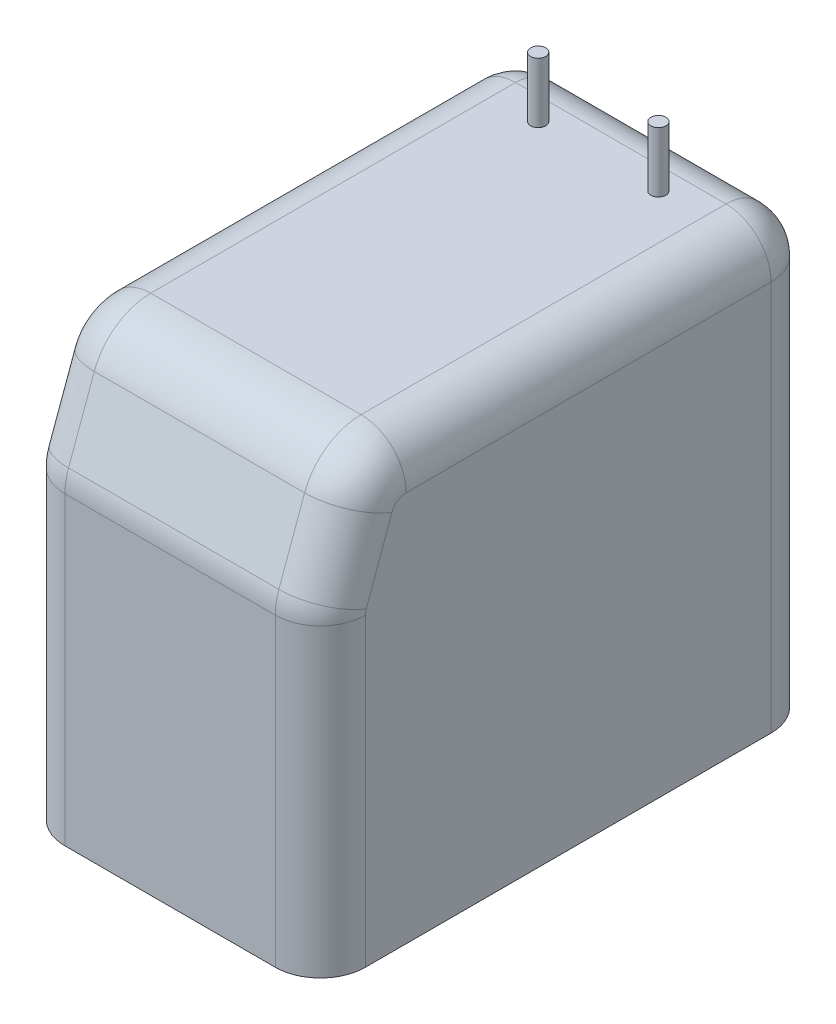
ISO-10303-21;
HEADER;
FILE_DESCRIPTION(('STEP AP214'),'2;1');
FILE_NAME('part.step','',(''),(''),'','','');
FILE_SCHEMA(('AUTOMOTIVE_DESIGN { 1 0 10303 214 1 1 1 1 }'));
ENDSEC;
DATA;
#1=APPLICATION_CONTEXT('core data for automotive mechanical design processes');
#2=APPLICATION_PROTOCOL_DEFINITION('international standard','automotive_design',2000,#1);
#3=PRODUCT_CONTEXT('',#1,'mechanical');
#4=PRODUCT('Part','Part','',(#3));
#5=PRODUCT_RELATED_PRODUCT_CATEGORY('part','',(#4));
#6=PRODUCT_DEFINITION_FORMATION('','',#4);
#7=PRODUCT_DEFINITION_CONTEXT('part definition',#1,'design');
#8=PRODUCT_DEFINITION('design','',#6,#7);
#9=PRODUCT_DEFINITION_SHAPE('','',#8);
#10=(LENGTH_UNIT() NAMED_UNIT(*) SI_UNIT(.MILLI.,.METRE.));
#11=(NAMED_UNIT(*) PLANE_ANGLE_UNIT() SI_UNIT($,.RADIAN.));
#12=(NAMED_UNIT(*) SI_UNIT($,.STERADIAN.) SOLID_ANGLE_UNIT());
#13=UNCERTAINTY_MEASURE_WITH_UNIT(LENGTH_MEASURE(1.E-05),#10,'distance_accuracy_value','');
#14=(GEOMETRIC_REPRESENTATION_CONTEXT(3) GLOBAL_UNCERTAINTY_ASSIGNED_CONTEXT((#13)) GLOBAL_UNIT_ASSIGNED_CONTEXT((#10,
#11,#12)) REPRESENTATION_CONTEXT('',''));
#15=CARTESIAN_POINT('',(0.,0.,0.));
#16=DIRECTION('',(0.,0.,1.));
#17=DIRECTION('',(1.,0.,0.));
#18=AXIS2_PLACEMENT_3D('',#15,#16,#17);
#19=CARTESIAN_POINT('',(127.,368.3,-209.55));
#20=DIRECTION('',(-1.,0.,0.));
#21=DIRECTION('',(0.,0.,1.));
#22=AXIS2_PLACEMENT_3D('',#19,#20,#21);
#23=PLANE('',#22);
#24=DIRECTION('',(0.,0.,-1.));
#25=VECTOR('',#24,1.);
#26=CARTESIAN_POINT('',(127.,0.,-209.55));
#27=LINE('',#26,#25);
#28=CARTESIAN_POINT('',(127.,0.,171.45));
#29=VERTEX_POINT('',#28);
#30=CARTESIAN_POINT('',(127.,0.,-171.45));
#31=VERTEX_POINT('',#30);
#32=EDGE_CURVE('E340',#29,#31,#27,.T.);
#33=ORIENTED_EDGE('',*,*,#32,.T.);
#34=DIRECTION('',(0.,-1.,0.));
#35=VECTOR('',#34,1.);
#36=CARTESIAN_POINT('',(127.,368.3,-171.45));
#37=LINE('',#36,#35);
#38=CARTESIAN_POINT('',(127.,330.2,-171.45));
#39=VERTEX_POINT('',#38);
#40=EDGE_CURVE('E11',#31,#39,#37,.F.);
#41=ORIENTED_EDGE('',*,*,#40,.T.);
#42=DIRECTION('',(0.,0.,-1.));
#43=VECTOR('',#42,1.);
#44=CARTESIAN_POINT('',(127.,330.2,137.0000812575));
#45=LINE('',#44,#43);
#46=CARTESIAN_POINT('',(127.,330.2,137.0000812575));
#47=VERTEX_POINT('',#46);
#48=EDGE_CURVE('E239',#39,#47,#45,.F.);
#49=ORIENTED_EDGE('',*,*,#48,.T.);
#50=CARTESIAN_POINT('',(127.,317.5,137.0000812575));
#51=DIRECTION('',(-1.,0.,0.));
#52=DIRECTION('',(0.,0.,1.));
#53=AXIS2_PLACEMENT_3D('',#50,#51,#52);
#54=CIRCLE('',#53,12.7);
#55=CARTESIAN_POINT('',(127.,321.843655820236,148.934177541481));
#56=VERTEX_POINT('',#55);
#57=EDGE_CURVE('E236',#47,#56,#54,.F.);
#58=ORIENTED_EDGE('',*,*,#57,.T.);
#59=DIRECTION('',(0.,-0.93969262078591,0.342020143325666));
#60=VECTOR('',#59,1.);
#61=CARTESIAN_POINT('',(127.,262.086245200245,170.684096283981));
#62=LINE('',#61,#60);
#63=CARTESIAN_POINT('',(127.,262.086245200245,170.684096283981));
#64=VERTEX_POINT('',#63);
#65=EDGE_CURVE('E233',#56,#64,#62,.T.);
#66=ORIENTED_EDGE('',*,*,#65,.T.);
#67=CARTESIAN_POINT('',(127.,257.742589380009,158.75));
#68=DIRECTION('',(-1.,0.,0.));
#69=DIRECTION('',(0.,0.,1.));
#70=AXIS2_PLACEMENT_3D('',#67,#68,#69);
#71=CIRCLE('',#70,12.7);
#72=CARTESIAN_POINT('',(127.,257.742589380009,171.45));
#73=VERTEX_POINT('',#72);
#74=EDGE_CURVE('E230',#64,#73,#71,.F.);
#75=ORIENTED_EDGE('',*,*,#74,.T.);
#76=DIRECTION('',(0.,-1.,0.));
#77=VECTOR('',#76,1.);
#78=CARTESIAN_POINT('',(127.,368.3,171.45));
#79=LINE('',#78,#77);
#80=EDGE_CURVE('E227',#73,#29,#79,.T.);
#81=ORIENTED_EDGE('',*,*,#80,.T.);
#82=EDGE_LOOP('',(#33,#41,#49,#58,#66,#75,#81));
#83=FACE_BOUND('',#82,.T.);
#84=ADVANCED_FACE('F41',(#83),#23,.F.);
#85=CARTESIAN_POINT('',(-127.,368.3,-209.55));
#86=DIRECTION('',(0.,0.,1.));
#87=DIRECTION('',(1.,0.,0.));
#88=AXIS2_PLACEMENT_3D('',#85,#86,#87);
#89=PLANE('',#88);
#90=DIRECTION('',(-1.,0.,0.));
#91=VECTOR('',#90,1.);
#92=CARTESIAN_POINT('',(-127.,0.,-209.55));
#93=LINE('',#92,#91);
#94=CARTESIAN_POINT('',(88.9,0.,-209.55));
#95=VERTEX_POINT('',#94);
#96=CARTESIAN_POINT('',(-88.9,0.,-209.55));
#97=VERTEX_POINT('',#96);
#98=EDGE_CURVE('E332',#95,#97,#93,.T.);
#99=ORIENTED_EDGE('',*,*,#98,.T.);
#100=DIRECTION('',(0.,-1.,0.));
#101=VECTOR('',#100,1.);
#102=CARTESIAN_POINT('',(-88.9,368.3,-209.55));
#103=LINE('',#102,#101);
#104=CARTESIAN_POINT('',(-88.9,330.2,-209.55));
#105=VERTEX_POINT('',#104);
#106=EDGE_CURVE('E297',#97,#105,#103,.F.);
#107=ORIENTED_EDGE('',*,*,#106,.T.);
#108=DIRECTION('',(-1.,0.,0.));
#109=VECTOR('',#108,1.);
#110=CARTESIAN_POINT('',(88.9,330.2,-209.55));
#111=LINE('',#110,#109);
#112=CARTESIAN_POINT('',(88.9,330.2,-209.55));
#113=VERTEX_POINT('',#112);
#114=EDGE_CURVE('E294',#105,#113,#111,.F.);
#115=ORIENTED_EDGE('',*,*,#114,.T.);
#116=DIRECTION('',(0.,-1.,0.));
#117=VECTOR('',#116,1.);
#118=CARTESIAN_POINT('',(88.9,368.3,-209.55));
#119=LINE('',#118,#117);
#120=EDGE_CURVE('E291',#113,#95,#119,.T.);
#121=ORIENTED_EDGE('',*,*,#120,.T.);
#122=EDGE_LOOP('',(#99,#107,#115,#121));
#123=FACE_BOUND('',#122,.T.);
#124=ADVANCED_FACE('F331',(#123),#89,.F.);
#125=CARTESIAN_POINT('',(-127.,368.3,-209.55));
#126=DIRECTION('',(1.,0.,0.));
#127=DIRECTION('',(0.,0.,-1.));
#128=AXIS2_PLACEMENT_3D('',#125,#126,#127);
#129=PLANE('',#128);
#130=DIRECTION('',(0.,0.,1.));
#131=VECTOR('',#130,1.);
#132=CARTESIAN_POINT('',(-127.,330.2,-209.55));
#133=LINE('',#132,#131);
#134=CARTESIAN_POINT('',(-127.,330.2,137.0000812575));
#135=VERTEX_POINT('',#134);
#136=CARTESIAN_POINT('',(-127.,330.2,-171.45));
#137=VERTEX_POINT('',#136);
#138=EDGE_CURVE('E170',#135,#137,#133,.F.);
#139=ORIENTED_EDGE('',*,*,#138,.T.);
#140=DIRECTION('',(0.,-1.,0.));
#141=VECTOR('',#140,1.);
#142=CARTESIAN_POINT('',(-127.,368.3,-171.45));
#143=LINE('',#142,#141);
#144=CARTESIAN_POINT('',(-127.,0.,-171.45));
#145=VERTEX_POINT('',#144);
#146=EDGE_CURVE('E254',#137,#145,#143,.T.);
#147=ORIENTED_EDGE('',*,*,#146,.T.);
#148=DIRECTION('',(0.,0.,1.));
#149=VECTOR('',#148,1.);
#150=CARTESIAN_POINT('',(-127.,0.,-209.55));
#151=LINE('',#150,#149);
#152=CARTESIAN_POINT('',(-127.,0.,171.45));
#153=VERTEX_POINT('',#152);
#154=EDGE_CURVE('E339',#145,#153,#151,.T.);
#155=ORIENTED_EDGE('',*,*,#154,.T.);
#156=DIRECTION('',(0.,-1.,0.));
#157=VECTOR('',#156,1.);
#158=CARTESIAN_POINT('',(-127.,368.3,171.45));
#159=LINE('',#158,#157);
#160=CARTESIAN_POINT('',(-127.,257.742589380009,171.45));
#161=VERTEX_POINT('',#160);
#162=EDGE_CURVE('E161',#153,#161,#159,.F.);
#163=ORIENTED_EDGE('',*,*,#162,.T.);
#164=CARTESIAN_POINT('',(-127.,257.742589380009,158.75));
#165=DIRECTION('',(1.,0.,0.));
#166=DIRECTION('',(0.,0.,-1.));
#167=AXIS2_PLACEMENT_3D('',#164,#165,#166);
#168=CIRCLE('',#167,12.7);
#169=CARTESIAN_POINT('',(-127.,262.086245200245,170.684096283981));
#170=VERTEX_POINT('',#169);
#171=EDGE_CURVE('E203',#161,#170,#168,.F.);
#172=ORIENTED_EDGE('',*,*,#171,.T.);
#173=DIRECTION('',(0.,0.93969262078591,-0.342020143325666));
#174=VECTOR('',#173,1.);
#175=CARTESIAN_POINT('',(-127.,321.843655820236,148.934177541481));
#176=LINE('',#175,#174);
#177=CARTESIAN_POINT('',(-127.,321.843655820236,148.934177541481));
#178=VERTEX_POINT('',#177);
#179=EDGE_CURVE('E206',#170,#178,#176,.T.);
#180=ORIENTED_EDGE('',*,*,#179,.T.);
#181=CARTESIAN_POINT('',(-127.,317.5,137.0000812575));
#182=DIRECTION('',(1.,0.,0.));
#183=DIRECTION('',(0.,0.,-1.));
#184=AXIS2_PLACEMENT_3D('',#181,#182,#183);
#185=CIRCLE('',#184,12.7);
#186=EDGE_CURVE('E209',#178,#135,#185,.F.);
#187=ORIENTED_EDGE('',*,*,#186,.T.);
#188=EDGE_LOOP('',(#139,#147,#155,#163,#172,#180,#187));
#189=FACE_BOUND('',#188,.T.);
#190=ADVANCED_FACE('F414',(#189),#129,.F.);
#191=CARTESIAN_POINT('',(-127.,368.3,209.55));
#192=DIRECTION('',(0.,0.,-1.));
#193=DIRECTION('',(-1.,0.,0.));
#194=AXIS2_PLACEMENT_3D('',#191,#192,#193);
#195=PLANE('',#194);
#196=DIRECTION('',(-1.,0.,0.));
#197=VECTOR('',#196,1.);
#198=CARTESIAN_POINT('',(-127.,257.742589380009,209.55));
#199=LINE('',#198,#197);
#200=CARTESIAN_POINT('',(88.9,257.742589380009,209.55));
#201=VERTEX_POINT('',#200);
#202=CARTESIAN_POINT('',(-88.9,257.742589380009,209.55));
#203=VERTEX_POINT('',#202);
#204=EDGE_CURVE('E353',#201,#203,#199,.T.);
#205=ORIENTED_EDGE('',*,*,#204,.T.);
#206=DIRECTION('',(0.,-1.,0.));
#207=VECTOR('',#206,1.);
#208=CARTESIAN_POINT('',(-88.9,368.3,209.55));
#209=LINE('',#208,#207);
#210=CARTESIAN_POINT('',(-88.9,0.,209.55));
#211=VERTEX_POINT('',#210);
#212=EDGE_CURVE('E245',#203,#211,#209,.T.);
#213=ORIENTED_EDGE('',*,*,#212,.T.);
#214=DIRECTION('',(1.,0.,0.));
#215=VECTOR('',#214,1.);
#216=CARTESIAN_POINT('',(-127.,0.,209.55));
#217=LINE('',#216,#215);
#218=CARTESIAN_POINT('',(88.9,0.,209.55));
#219=VERTEX_POINT('',#218);
#220=EDGE_CURVE('E344',#211,#219,#217,.T.);
#221=ORIENTED_EDGE('',*,*,#220,.T.);
#222=DIRECTION('',(0.,-1.,0.));
#223=VECTOR('',#222,1.);
#224=CARTESIAN_POINT('',(88.9,368.3,209.55));
#225=LINE('',#224,#223);
#226=EDGE_CURVE('E242',#219,#201,#225,.F.);
#227=ORIENTED_EDGE('',*,*,#226,.T.);
#228=EDGE_LOOP('',(#205,#213,#221,#227));
#229=FACE_BOUND('',#228,.T.);
#230=ADVANCED_FACE('F378',(#229),#195,.F.);
#231=CARTESIAN_POINT('',(0.,368.3,0.));
#232=DIRECTION('',(0.,1.,0.));
#233=DIRECTION('',(0.,0.,1.));
#234=AXIS2_PLACEMENT_3D('',#231,#232,#233);
#235=PLANE('',#234);
#236=CARTESIAN_POINT('',(50.8,368.3,-152.4));
#237=DIRECTION('',(0.,1.,0.));
#238=DIRECTION('',(0.,0.,1.));
#239=AXIS2_PLACEMENT_3D('',#236,#237,#238);
#240=CIRCLE('',#239,6.34999999999999);
#241=CARTESIAN_POINT('',(50.8,368.3,-146.05));
#242=VERTEX_POINT('',#241);
#243=EDGE_CURVE('E266',#242,#242,#240,.T.);
#244=ORIENTED_EDGE('',*,*,#243,.F.);
#245=EDGE_LOOP('',(#244));
#246=FACE_BOUND('',#245,.T.);
#247=CARTESIAN_POINT('',(-50.8,368.3,-152.4));
#248=DIRECTION('',(0.,1.,0.));
#249=DIRECTION('',(0.,0.,1.));
#250=AXIS2_PLACEMENT_3D('',#247,#248,#249);
#251=CIRCLE('',#250,6.34999999999999);
#252=CARTESIAN_POINT('',(-50.8,368.3,-146.05));
#253=VERTEX_POINT('',#252);
#254=EDGE_CURVE('E660',#253,#253,#251,.T.);
#255=ORIENTED_EDGE('',*,*,#254,.F.);
#256=EDGE_LOOP('',(#255));
#257=FACE_BOUND('',#256,.T.);
#258=DIRECTION('',(0.,0.,-1.));
#259=VECTOR('',#258,1.);
#260=CARTESIAN_POINT('',(88.9,368.3,-209.55));
#261=LINE('',#260,#259);
#262=CARTESIAN_POINT('',(88.9,368.3,137.0000812575));
#263=VERTEX_POINT('',#262);
#264=CARTESIAN_POINT('',(88.9,368.3,-171.45));
#265=VERTEX_POINT('',#264);
#266=EDGE_CURVE('E162',#263,#265,#261,.T.);
#267=ORIENTED_EDGE('',*,*,#266,.T.);
#268=DIRECTION('',(-1.,0.,0.));
#269=VECTOR('',#268,1.);
#270=CARTESIAN_POINT('',(-88.9,368.3,-171.45));
#271=LINE('',#270,#269);
#272=CARTESIAN_POINT('',(-88.9,368.3,-171.45));
#273=VERTEX_POINT('',#272);
#274=EDGE_CURVE('E157',#265,#273,#271,.T.);
#275=ORIENTED_EDGE('',*,*,#274,.T.);
#276=DIRECTION('',(0.,0.,1.));
#277=VECTOR('',#276,1.);
#278=CARTESIAN_POINT('',(-88.9,368.3,137.0000812575));
#279=LINE('',#278,#277);
#280=CARTESIAN_POINT('',(-88.9,368.3,137.0000812575));
#281=VERTEX_POINT('',#280);
#282=EDGE_CURVE('E150',#273,#281,#279,.T.);
#283=ORIENTED_EDGE('',*,*,#282,.T.);
#284=DIRECTION('',(1.,0.,0.));
#285=VECTOR('',#284,1.);
#286=CARTESIAN_POINT('',(0.,368.3,137.0000812575));
#287=LINE('',#286,#285);
#288=EDGE_CURVE('E154',#281,#263,#287,.T.);
#289=ORIENTED_EDGE('',*,*,#288,.T.);
#290=EDGE_LOOP('',(#267,#275,#283,#289));
#291=FACE_BOUND('',#290,.T.);
#292=ADVANCED_FACE('F152',(#246,#257,#291),#235,.T.);
#293=CARTESIAN_POINT('',(0.,0.,0.));
#294=DIRECTION('',(0.,1.,0.));
#295=DIRECTION('',(0.,0.,1.));
#296=AXIS2_PLACEMENT_3D('',#293,#294,#295);
#297=PLANE('',#296);
#298=ORIENTED_EDGE('',*,*,#154,.F.);
#299=CARTESIAN_POINT('',(-88.9,0.,-171.45));
#300=DIRECTION('',(0.,1.,0.));
#301=DIRECTION('',(0.,0.,1.));
#302=AXIS2_PLACEMENT_3D('',#299,#300,#301);
#303=CIRCLE('',#302,38.1);
#304=EDGE_CURVE('E288',#145,#97,#303,.F.);
#305=ORIENTED_EDGE('',*,*,#304,.T.);
#306=ORIENTED_EDGE('',*,*,#98,.F.);
#307=CARTESIAN_POINT('',(88.9,0.,-171.45));
#308=DIRECTION('',(0.,1.,0.));
#309=DIRECTION('',(0.,0.,1.));
#310=AXIS2_PLACEMENT_3D('',#307,#308,#309);
#311=CIRCLE('',#310,38.1);
#312=EDGE_CURVE('E285',#95,#31,#311,.F.);
#313=ORIENTED_EDGE('',*,*,#312,.T.);
#314=ORIENTED_EDGE('',*,*,#32,.F.);
#315=CARTESIAN_POINT('',(88.9,0.,171.45));
#316=DIRECTION('',(0.,1.,0.));
#317=DIRECTION('',(0.,0.,1.));
#318=AXIS2_PLACEMENT_3D('',#315,#316,#317);
#319=CIRCLE('',#318,38.1);
#320=EDGE_CURVE('E248',#29,#219,#319,.F.);
#321=ORIENTED_EDGE('',*,*,#320,.T.);
#322=ORIENTED_EDGE('',*,*,#220,.F.);
#323=CARTESIAN_POINT('',(-88.9,0.,171.45));
#324=DIRECTION('',(0.,1.,0.));
#325=DIRECTION('',(0.,0.,1.));
#326=AXIS2_PLACEMENT_3D('',#323,#324,#325);
#327=CIRCLE('',#326,38.1);
#328=EDGE_CURVE('E251',#211,#153,#327,.F.);
#329=ORIENTED_EDGE('',*,*,#328,.T.);
#330=EDGE_LOOP('',(#298,#305,#306,#313,#314,#321,#322,#329));
#331=FACE_BOUND('',#330,.T.);
#332=ADVANCED_FACE('F336',(#331),#297,.F.);
#333=CARTESIAN_POINT('',(0.,368.3,172.570624198554));
#334=DIRECTION('',(0.,0.342020143325666,0.939692620785909));
#335=DIRECTION('',(-1.,0.,0.));
#336=AXIS2_PLACEMENT_3D('',#333,#334,#335);
#337=PLANE('',#336);
#338=DIRECTION('',(1.,0.,0.));
#339=VECTOR('',#338,1.);
#340=CARTESIAN_POINT('',(0.,334.874623280944,184.736466393425));
#341=LINE('',#340,#339);
#342=CARTESIAN_POINT('',(88.9,334.874623280944,184.736466393425));
#343=VERTEX_POINT('',#342);
#344=CARTESIAN_POINT('',(-88.9,334.874623280944,184.736466393425));
#345=VERTEX_POINT('',#344);
#346=EDGE_CURVE('E197',#343,#345,#341,.F.);
#347=ORIENTED_EDGE('',*,*,#346,.T.);
#348=DIRECTION('',(0.,0.93969262078591,-0.342020143325666));
#349=VECTOR('',#348,1.);
#350=CARTESIAN_POINT('',(-88.9,275.117212660953,206.486385135924));
#351=LINE('',#350,#349);
#352=CARTESIAN_POINT('',(-88.9,275.117212660953,206.486385135924));
#353=VERTEX_POINT('',#352);
#354=EDGE_CURVE('E218',#345,#353,#351,.F.);
#355=ORIENTED_EDGE('',*,*,#354,.T.);
#356=DIRECTION('',(-1.,0.,0.));
#357=VECTOR('',#356,1.);
#358=CARTESIAN_POINT('',(127.,275.117212660953,206.486385135924));
#359=LINE('',#358,#357);
#360=CARTESIAN_POINT('',(88.9,275.117212660953,206.486385135924));
#361=VERTEX_POINT('',#360);
#362=EDGE_CURVE('E191',#353,#361,#359,.F.);
#363=ORIENTED_EDGE('',*,*,#362,.T.);
#364=DIRECTION('',(0.,-0.93969262078591,0.342020143325666));
#365=VECTOR('',#364,1.);
#366=CARTESIAN_POINT('',(88.9,334.874623280944,184.736466393425));
#367=LINE('',#366,#365);
#368=EDGE_CURVE('E185',#361,#343,#367,.F.);
#369=ORIENTED_EDGE('',*,*,#368,.T.);
#370=EDGE_LOOP('',(#347,#355,#363,#369));
#371=FACE_BOUND('',#370,.T.);
#372=ADVANCED_FACE('F359',(#371),#337,.T.);
#373=CARTESIAN_POINT('',(-127.,257.742589380009,158.75));
#374=DIRECTION('',(1.,0.,0.));
#375=DIRECTION('',(0.,0.,-1.));
#376=AXIS2_PLACEMENT_3D('',#373,#374,#375);
#377=CYLINDRICAL_SURFACE('',#376,50.8);
#378=ORIENTED_EDGE('',*,*,#362,.F.);
#379=CARTESIAN_POINT('',(-88.9,257.742589380009,158.75));
#380=DIRECTION('',(1.,0.,0.));
#381=DIRECTION('',(0.,0.,-1.));
#382=AXIS2_PLACEMENT_3D('',#379,#380,#381);
#383=CIRCLE('',#382,50.8);
#384=EDGE_CURVE('E224',#353,#203,#383,.T.);
#385=ORIENTED_EDGE('',*,*,#384,.T.);
#386=ORIENTED_EDGE('',*,*,#204,.F.);
#387=CARTESIAN_POINT('',(88.9,257.742589380009,158.75));
#388=DIRECTION('',(-1.,0.,0.));
#389=DIRECTION('',(0.,0.,1.));
#390=AXIS2_PLACEMENT_3D('',#387,#388,#389);
#391=CIRCLE('',#390,50.8);
#392=EDGE_CURVE('E221',#201,#361,#391,.T.);
#393=ORIENTED_EDGE('',*,*,#392,.T.);
#394=EDGE_LOOP('',(#378,#385,#386,#393));
#395=FACE_BOUND('',#394,.T.);
#396=ADVANCED_FACE('F374',(#395),#377,.T.);
#397=CARTESIAN_POINT('',(0.,317.5,137.0000812575));
#398=DIRECTION('',(1.,0.,0.));
#399=DIRECTION('',(0.,0.,-1.));
#400=AXIS2_PLACEMENT_3D('',#397,#398,#399);
#401=CYLINDRICAL_SURFACE('',#400,50.8);
#402=ORIENTED_EDGE('',*,*,#288,.F.);
#403=CARTESIAN_POINT('',(-88.9,317.5,137.0000812575));
#404=DIRECTION('',(1.,0.,0.));
#405=DIRECTION('',(0.,0.,-1.));
#406=AXIS2_PLACEMENT_3D('',#403,#404,#405);
#407=CIRCLE('',#406,50.8);
#408=EDGE_CURVE('E178',#281,#345,#407,.T.);
#409=ORIENTED_EDGE('',*,*,#408,.T.);
#410=ORIENTED_EDGE('',*,*,#346,.F.);
#411=CARTESIAN_POINT('',(88.9,317.5,137.0000812575));
#412=DIRECTION('',(-1.,0.,0.));
#413=DIRECTION('',(0.,0.,1.));
#414=AXIS2_PLACEMENT_3D('',#411,#412,#413);
#415=CIRCLE('',#414,50.8);
#416=EDGE_CURVE('E186',#343,#263,#415,.T.);
#417=ORIENTED_EDGE('',*,*,#416,.T.);
#418=EDGE_LOOP('',(#402,#409,#410,#417));
#419=FACE_BOUND('',#418,.T.);
#420=ADVANCED_FACE('F188',(#419),#401,.T.);
#421=CARTESIAN_POINT('',(-50.8,419.1,-152.4));
#422=DIRECTION('',(0.,-1.,0.));
#423=DIRECTION('',(0.,0.,-1.));
#424=AXIS2_PLACEMENT_3D('',#421,#422,#423);
#425=CYLINDRICAL_SURFACE('',#424,6.34999999999999);
#426=CARTESIAN_POINT('',(-50.8,419.1,-152.4));
#427=DIRECTION('',(0.,1.,0.));
#428=DIRECTION('',(0.,0.,1.));
#429=AXIS2_PLACEMENT_3D('',#426,#427,#428);
#430=CIRCLE('',#429,6.34999999999999);
#431=CARTESIAN_POINT('',(-50.8,419.1,-146.05));
#432=VERTEX_POINT('',#431);
#433=EDGE_CURVE('E346',#432,#432,#430,.T.);
#434=ORIENTED_EDGE('',*,*,#433,.F.);
#435=EDGE_LOOP('',(#434));
#436=FACE_BOUND('',#435,.T.);
#437=ORIENTED_EDGE('',*,*,#254,.T.);
#438=EDGE_LOOP('',(#437));
#439=FACE_BOUND('',#438,.T.);
#440=ADVANCED_FACE('F424',(#436,#439),#425,.T.);
#441=CARTESIAN_POINT('',(-50.8,419.1,-152.4));
#442=DIRECTION('',(0.,1.,0.));
#443=DIRECTION('',(0.,0.,1.));
#444=AXIS2_PLACEMENT_3D('',#441,#442,#443);
#445=PLANE('',#444);
#446=ORIENTED_EDGE('',*,*,#433,.T.);
#447=EDGE_LOOP('',(#446));
#448=FACE_BOUND('',#447,.T.);
#449=ADVANCED_FACE('F443',(#448),#445,.T.);
#450=CARTESIAN_POINT('',(50.8,419.1,-152.4));
#451=DIRECTION('',(0.,-1.,0.));
#452=DIRECTION('',(0.,0.,-1.));
#453=AXIS2_PLACEMENT_3D('',#450,#451,#452);
#454=CYLINDRICAL_SURFACE('',#453,6.34999999999999);
#455=CARTESIAN_POINT('',(50.8,419.1,-152.4));
#456=DIRECTION('',(0.,1.,0.));
#457=DIRECTION('',(0.,0.,1.));
#458=AXIS2_PLACEMENT_3D('',#455,#456,#457);
#459=CIRCLE('',#458,6.34999999999999);
#460=CARTESIAN_POINT('',(50.8,419.1,-146.05));
#461=VERTEX_POINT('',#460);
#462=EDGE_CURVE('E663',#461,#461,#459,.T.);
#463=ORIENTED_EDGE('',*,*,#462,.F.);
#464=EDGE_LOOP('',(#463));
#465=FACE_BOUND('',#464,.T.);
#466=ORIENTED_EDGE('',*,*,#243,.T.);
#467=EDGE_LOOP('',(#466));
#468=FACE_BOUND('',#467,.T.);
#469=ADVANCED_FACE('F437',(#465,#468),#454,.T.);
#470=CARTESIAN_POINT('',(50.8,419.1,-152.4));
#471=DIRECTION('',(0.,1.,0.));
#472=DIRECTION('',(0.,0.,1.));
#473=AXIS2_PLACEMENT_3D('',#470,#471,#472);
#474=PLANE('',#473);
#475=ORIENTED_EDGE('',*,*,#462,.T.);
#476=EDGE_LOOP('',(#475));
#477=FACE_BOUND('',#476,.T.);
#478=ADVANCED_FACE('F433',(#477),#474,.T.);
#479=CARTESIAN_POINT('',(-88.9,368.3,171.45));
#480=DIRECTION('',(0.,-1.,0.));
#481=DIRECTION('',(0.,0.,-1.));
#482=AXIS2_PLACEMENT_3D('',#479,#480,#481);
#483=CYLINDRICAL_SURFACE('',#482,38.1);
#484=ORIENTED_EDGE('',*,*,#328,.F.);
#485=ORIENTED_EDGE('',*,*,#212,.F.);
#486=CARTESIAN_POINT('',(-88.9,257.742589380009,171.45));
#487=DIRECTION('',(0.,1.,0.));
#488=DIRECTION('',(0.,0.,1.));
#489=AXIS2_PLACEMENT_3D('',#486,#487,#488);
#490=CIRCLE('',#489,38.1);
#491=EDGE_CURVE('E262',#161,#203,#490,.T.);
#492=ORIENTED_EDGE('',*,*,#491,.F.);
#493=ORIENTED_EDGE('',*,*,#162,.F.);
#494=EDGE_LOOP('',(#484,#485,#492,#493));
#495=FACE_BOUND('',#494,.T.);
#496=ADVANCED_FACE('F383',(#495),#483,.T.);
#497=CARTESIAN_POINT('',(-88.9,257.742589380009,158.75));
#498=DIRECTION('',(1.,0.,0.));
#499=DIRECTION('',(0.,0.,-1.));
#500=AXIS2_PLACEMENT_3D('',#497,#498,#499);
#501=DEGENERATE_TOROIDAL_SURFACE('',#500,12.7,38.1,.T.);
#502=ORIENTED_EDGE('',*,*,#491,.T.);
#503=ORIENTED_EDGE('',*,*,#384,.F.);
#504=CARTESIAN_POINT('',(-88.9,262.086245200245,170.684096283981));
#505=DIRECTION('',(0.,0.939692620785909,-0.342020143325666));
#506=DIRECTION('',(0.,0.342020143325666,0.939692620785909));
#507=AXIS2_PLACEMENT_3D('',#504,#505,#506);
#508=CIRCLE('',#507,38.1);
#509=EDGE_CURVE('E258',#170,#353,#508,.T.);
#510=ORIENTED_EDGE('',*,*,#509,.F.);
#511=ORIENTED_EDGE('',*,*,#171,.F.);
#512=EDGE_LOOP('',(#502,#503,#510,#511));
#513=FACE_BOUND('',#512,.T.);
#514=ADVANCED_FACE('F370',(#513),#501,.T.);
#515=CARTESIAN_POINT('',(-88.9,478.08023385955,92.0687136315632));
#516=DIRECTION('',(0.,-0.93969262078591,0.342020143325666));
#517=DIRECTION('',(0.,-0.342020143325666,-0.93969262078591));
#518=AXIS2_PLACEMENT_3D('',#515,#516,#517);
#519=CYLINDRICAL_SURFACE('',#518,38.1);
#520=ORIENTED_EDGE('',*,*,#509,.T.);
#521=ORIENTED_EDGE('',*,*,#354,.F.);
#522=CARTESIAN_POINT('',(-88.9,321.843655820236,148.934177541481));
#523=DIRECTION('',(0.,0.939692620785909,-0.342020143325668));
#524=DIRECTION('',(0.,0.342020143325668,0.939692620785909));
#525=AXIS2_PLACEMENT_3D('',#522,#523,#524);
#526=CIRCLE('',#525,38.1);
#527=EDGE_CURVE('E174',#178,#345,#526,.T.);
#528=ORIENTED_EDGE('',*,*,#527,.F.);
#529=ORIENTED_EDGE('',*,*,#179,.F.);
#530=EDGE_LOOP('',(#520,#521,#528,#529));
#531=FACE_BOUND('',#530,.T.);
#532=ADVANCED_FACE('F364',(#531),#519,.T.);
#533=CARTESIAN_POINT('',(-88.9,317.5,137.0000812575));
#534=DIRECTION('',(1.,0.,0.));
#535=DIRECTION('',(0.,0.,-1.));
#536=AXIS2_PLACEMENT_3D('',#533,#534,#535);
#537=DEGENERATE_TOROIDAL_SURFACE('',#536,12.7,38.1,.T.);
#538=ORIENTED_EDGE('',*,*,#527,.T.);
#539=ORIENTED_EDGE('',*,*,#408,.F.);
#540=CARTESIAN_POINT('',(-88.9,330.2,137.0000812575));
#541=DIRECTION('',(0.,0.,-1.));
#542=DIRECTION('',(-1.,0.,0.));
#543=AXIS2_PLACEMENT_3D('',#540,#541,#542);
#544=CIRCLE('',#543,38.1);
#545=EDGE_CURVE('E166',#135,#281,#544,.T.);
#546=ORIENTED_EDGE('',*,*,#545,.F.);
#547=ORIENTED_EDGE('',*,*,#186,.F.);
#548=EDGE_LOOP('',(#538,#539,#546,#547));
#549=FACE_BOUND('',#548,.T.);
#550=ADVANCED_FACE('F179',(#549),#537,.T.);
#551=CARTESIAN_POINT('',(-88.9,330.2,0.));
#552=DIRECTION('',(0.,0.,-1.));
#553=DIRECTION('',(-1.,0.,0.));
#554=AXIS2_PLACEMENT_3D('',#551,#552,#553);
#555=CYLINDRICAL_SURFACE('',#554,38.1);
#556=ORIENTED_EDGE('',*,*,#282,.F.);
#557=CARTESIAN_POINT('',(-88.9,330.2,-171.45));
#558=DIRECTION('',(0.,0.,-1.));
#559=DIRECTION('',(-1.,0.,0.));
#560=AXIS2_PLACEMENT_3D('',#557,#558,#559);
#561=CIRCLE('',#560,38.1);
#562=EDGE_CURVE('E300',#273,#137,#561,.F.);
#563=ORIENTED_EDGE('',*,*,#562,.T.);
#564=ORIENTED_EDGE('',*,*,#138,.F.);
#565=ORIENTED_EDGE('',*,*,#545,.T.);
#566=EDGE_LOOP('',(#556,#563,#564,#565));
#567=FACE_BOUND('',#566,.T.);
#568=ADVANCED_FACE('F168',(#567),#555,.T.);
#569=CARTESIAN_POINT('',(88.9,368.3,171.45));
#570=DIRECTION('',(0.,-1.,0.));
#571=DIRECTION('',(0.,0.,-1.));
#572=AXIS2_PLACEMENT_3D('',#569,#570,#571);
#573=CYLINDRICAL_SURFACE('',#572,38.1);
#574=ORIENTED_EDGE('',*,*,#320,.F.);
#575=ORIENTED_EDGE('',*,*,#80,.F.);
#576=CARTESIAN_POINT('',(88.9,257.742589380009,171.45));
#577=DIRECTION('',(0.,1.,0.));
#578=DIRECTION('',(0.,0.,1.));
#579=AXIS2_PLACEMENT_3D('',#576,#577,#578);
#580=CIRCLE('',#579,38.1);
#581=EDGE_CURVE('E175',#201,#73,#580,.T.);
#582=ORIENTED_EDGE('',*,*,#581,.F.);
#583=ORIENTED_EDGE('',*,*,#226,.F.);
#584=EDGE_LOOP('',(#574,#575,#582,#583));
#585=FACE_BOUND('',#584,.T.);
#586=ADVANCED_FACE('F387',(#585),#573,.T.);
#587=CARTESIAN_POINT('',(88.9,257.742589380009,158.75));
#588=DIRECTION('',(-1.,0.,0.));
#589=DIRECTION('',(0.,0.,1.));
#590=AXIS2_PLACEMENT_3D('',#587,#588,#589);
#591=DEGENERATE_TOROIDAL_SURFACE('',#590,12.7,38.1,.T.);
#592=ORIENTED_EDGE('',*,*,#581,.T.);
#593=ORIENTED_EDGE('',*,*,#74,.F.);
#594=CARTESIAN_POINT('',(88.9,262.086245200245,170.684096283981));
#595=DIRECTION('',(0.,0.939692620785909,-0.342020143325667));
#596=DIRECTION('',(0.,0.342020143325667,0.939692620785909));
#597=AXIS2_PLACEMENT_3D('',#594,#595,#596);
#598=CIRCLE('',#597,38.1);
#599=EDGE_CURVE('E275',#361,#64,#598,.T.);
#600=ORIENTED_EDGE('',*,*,#599,.F.);
#601=ORIENTED_EDGE('',*,*,#392,.F.);
#602=EDGE_LOOP('',(#592,#593,#600,#601));
#603=FACE_BOUND('',#602,.T.);
#604=ADVANCED_FACE('F393',(#603),#591,.T.);
#605=CARTESIAN_POINT('',(88.9,478.08023385955,92.0687136315632));
#606=DIRECTION('',(0.,0.93969262078591,-0.342020143325666));
#607=DIRECTION('',(0.,0.342020143325666,0.93969262078591));
#608=AXIS2_PLACEMENT_3D('',#605,#606,#607);
#609=CYLINDRICAL_SURFACE('',#608,38.1);
#610=ORIENTED_EDGE('',*,*,#599,.T.);
#611=ORIENTED_EDGE('',*,*,#65,.F.);
#612=CARTESIAN_POINT('',(88.9,321.843655820236,148.934177541481));
#613=DIRECTION('',(0.,0.939692620785909,-0.342020143325666));
#614=DIRECTION('',(0.,0.342020143325666,0.939692620785909));
#615=AXIS2_PLACEMENT_3D('',#612,#613,#614);
#616=CIRCLE('',#615,38.1);
#617=EDGE_CURVE('E271',#343,#56,#616,.T.);
#618=ORIENTED_EDGE('',*,*,#617,.F.);
#619=ORIENTED_EDGE('',*,*,#368,.F.);
#620=EDGE_LOOP('',(#610,#611,#618,#619));
#621=FACE_BOUND('',#620,.T.);
#622=ADVANCED_FACE('F396',(#621),#609,.T.);
#623=CARTESIAN_POINT('',(88.9,317.5,137.0000812575));
#624=DIRECTION('',(-1.,0.,0.));
#625=DIRECTION('',(0.,0.,1.));
#626=AXIS2_PLACEMENT_3D('',#623,#624,#625);
#627=DEGENERATE_TOROIDAL_SURFACE('',#626,12.7,38.1,.T.);
#628=ORIENTED_EDGE('',*,*,#617,.T.);
#629=ORIENTED_EDGE('',*,*,#57,.F.);
#630=CARTESIAN_POINT('',(88.9,330.2,137.0000812575));
#631=DIRECTION('',(0.,0.,-1.));
#632=DIRECTION('',(-1.,0.,0.));
#633=AXIS2_PLACEMENT_3D('',#630,#631,#632);
#634=CIRCLE('',#633,38.1);
#635=EDGE_CURVE('E267',#263,#47,#634,.T.);
#636=ORIENTED_EDGE('',*,*,#635,.F.);
#637=ORIENTED_EDGE('',*,*,#416,.F.);
#638=EDGE_LOOP('',(#628,#629,#636,#637));
#639=FACE_BOUND('',#638,.T.);
#640=ADVANCED_FACE('F399',(#639),#627,.T.);
#641=CARTESIAN_POINT('',(88.9,330.2,0.));
#642=DIRECTION('',(0.,0.,1.));
#643=DIRECTION('',(1.,0.,0.));
#644=AXIS2_PLACEMENT_3D('',#641,#642,#643);
#645=CYLINDRICAL_SURFACE('',#644,38.1);
#646=ORIENTED_EDGE('',*,*,#48,.F.);
#647=CARTESIAN_POINT('',(88.9,330.2,-171.45));
#648=DIRECTION('',(0.,0.,1.));
#649=DIRECTION('',(1.,0.,0.));
#650=AXIS2_PLACEMENT_3D('',#647,#648,#649);
#651=CIRCLE('',#650,38.1);
#652=EDGE_CURVE('E51',#39,#265,#651,.T.);
#653=ORIENTED_EDGE('',*,*,#652,.T.);
#654=ORIENTED_EDGE('',*,*,#266,.F.);
#655=ORIENTED_EDGE('',*,*,#635,.T.);
#656=EDGE_LOOP('',(#646,#653,#654,#655));
#657=FACE_BOUND('',#656,.T.);
#658=ADVANCED_FACE('F400',(#657),#645,.T.);
#659=CARTESIAN_POINT('',(88.9,368.3,-171.45));
#660=DIRECTION('',(0.,-1.,0.));
#661=DIRECTION('',(0.,0.,-1.));
#662=AXIS2_PLACEMENT_3D('',#659,#660,#661);
#663=CYLINDRICAL_SURFACE('',#662,38.1);
#664=CARTESIAN_POINT('',(88.9,330.2,-171.45));
#665=DIRECTION('',(0.,1.,0.));
#666=DIRECTION('',(0.,0.,1.));
#667=AXIS2_PLACEMENT_3D('',#664,#665,#666);
#668=CIRCLE('',#667,38.1);
#669=EDGE_CURVE('E45',#39,#113,#668,.T.);
#670=ORIENTED_EDGE('',*,*,#669,.F.);
#671=ORIENTED_EDGE('',*,*,#40,.F.);
#672=ORIENTED_EDGE('',*,*,#312,.F.);
#673=ORIENTED_EDGE('',*,*,#120,.F.);
#674=EDGE_LOOP('',(#670,#671,#672,#673));
#675=FACE_BOUND('',#674,.T.);
#676=ADVANCED_FACE('F43',(#675),#663,.T.);
#677=CARTESIAN_POINT('',(88.9,330.2,-171.45));
#678=DIRECTION('',(0.,0.,1.));
#679=DIRECTION('',(1.,0.,0.));
#680=AXIS2_PLACEMENT_3D('',#677,#678,#679);
#681=SPHERICAL_SURFACE('',#680,38.1);
#682=ORIENTED_EDGE('',*,*,#652,.F.);
#683=ORIENTED_EDGE('',*,*,#669,.T.);
#684=CARTESIAN_POINT('',(88.9,330.2,-171.45));
#685=DIRECTION('',(-1.,0.,0.));
#686=DIRECTION('',(0.,0.,1.));
#687=AXIS2_PLACEMENT_3D('',#684,#685,#686);
#688=CIRCLE('',#687,38.1);
#689=EDGE_CURVE('E314',#265,#113,#688,.T.);
#690=ORIENTED_EDGE('',*,*,#689,.F.);
#691=EDGE_LOOP('',(#682,#683,#690));
#692=FACE_BOUND('',#691,.T.);
#693=ADVANCED_FACE('F324',(#692),#681,.T.);
#694=CARTESIAN_POINT('',(0.,330.2,-171.45));
#695=DIRECTION('',(1.,0.,0.));
#696=DIRECTION('',(0.,0.,-1.));
#697=AXIS2_PLACEMENT_3D('',#694,#695,#696);
#698=CYLINDRICAL_SURFACE('',#697,38.1);
#699=CARTESIAN_POINT('',(-88.9,330.2,-171.45));
#700=DIRECTION('',(-1.,0.,0.));
#701=DIRECTION('',(0.,0.,1.));
#702=AXIS2_PLACEMENT_3D('',#699,#700,#701);
#703=CIRCLE('',#702,38.1);
#704=EDGE_CURVE('E311',#273,#105,#703,.T.);
#705=ORIENTED_EDGE('',*,*,#704,.F.);
#706=ORIENTED_EDGE('',*,*,#274,.F.);
#707=ORIENTED_EDGE('',*,*,#689,.T.);
#708=ORIENTED_EDGE('',*,*,#114,.F.);
#709=EDGE_LOOP('',(#705,#706,#707,#708));
#710=FACE_BOUND('',#709,.T.);
#711=ADVANCED_FACE('F471',(#710),#698,.T.);
#712=CARTESIAN_POINT('',(-88.9,330.2,-171.45));
#713=DIRECTION('',(0.,0.,1.));
#714=DIRECTION('',(1.,0.,0.));
#715=AXIS2_PLACEMENT_3D('',#712,#713,#714);
#716=SPHERICAL_SURFACE('',#715,38.1);
#717=ORIENTED_EDGE('',*,*,#562,.F.);
#718=ORIENTED_EDGE('',*,*,#704,.T.);
#719=CARTESIAN_POINT('',(-88.9,330.2,-171.45));
#720=DIRECTION('',(0.,-1.,0.));
#721=DIRECTION('',(0.,0.,-1.));
#722=AXIS2_PLACEMENT_3D('',#719,#720,#721);
#723=CIRCLE('',#722,38.1);
#724=EDGE_CURVE('E307',#137,#105,#723,.T.);
#725=ORIENTED_EDGE('',*,*,#724,.F.);
#726=EDGE_LOOP('',(#717,#718,#725));
#727=FACE_BOUND('',#726,.T.);
#728=ADVANCED_FACE('F468',(#727),#716,.T.);
#729=CARTESIAN_POINT('',(-88.9,368.3,-171.45));
#730=DIRECTION('',(0.,-1.,0.));
#731=DIRECTION('',(0.,0.,-1.));
#732=AXIS2_PLACEMENT_3D('',#729,#730,#731);
#733=CYLINDRICAL_SURFACE('',#732,38.1);
#734=ORIENTED_EDGE('',*,*,#724,.T.);
#735=ORIENTED_EDGE('',*,*,#106,.F.);
#736=ORIENTED_EDGE('',*,*,#304,.F.);
#737=ORIENTED_EDGE('',*,*,#146,.F.);
#738=EDGE_LOOP('',(#734,#735,#736,#737));
#739=FACE_BOUND('',#738,.T.);
#740=ADVANCED_FACE('F470',(#739),#733,.T.);
#741=CLOSED_SHELL('',(#84,#124,#190,#230,#292,#332,#372,#396,#420,#440,#449,#469,#478,#496,#514,
#532,#550,#568,#586,#604,#622,#640,#658,#676,#693,#711,#728,#740));
#742=MANIFOLD_SOLID_BREP('B2',#741);
#743=ADVANCED_BREP_SHAPE_REPRESENTATION('',(#18,#742),#14);
#744=SHAPE_DEFINITION_REPRESENTATION(#9,#743);
ENDSEC;
END-ISO-10303-21;
